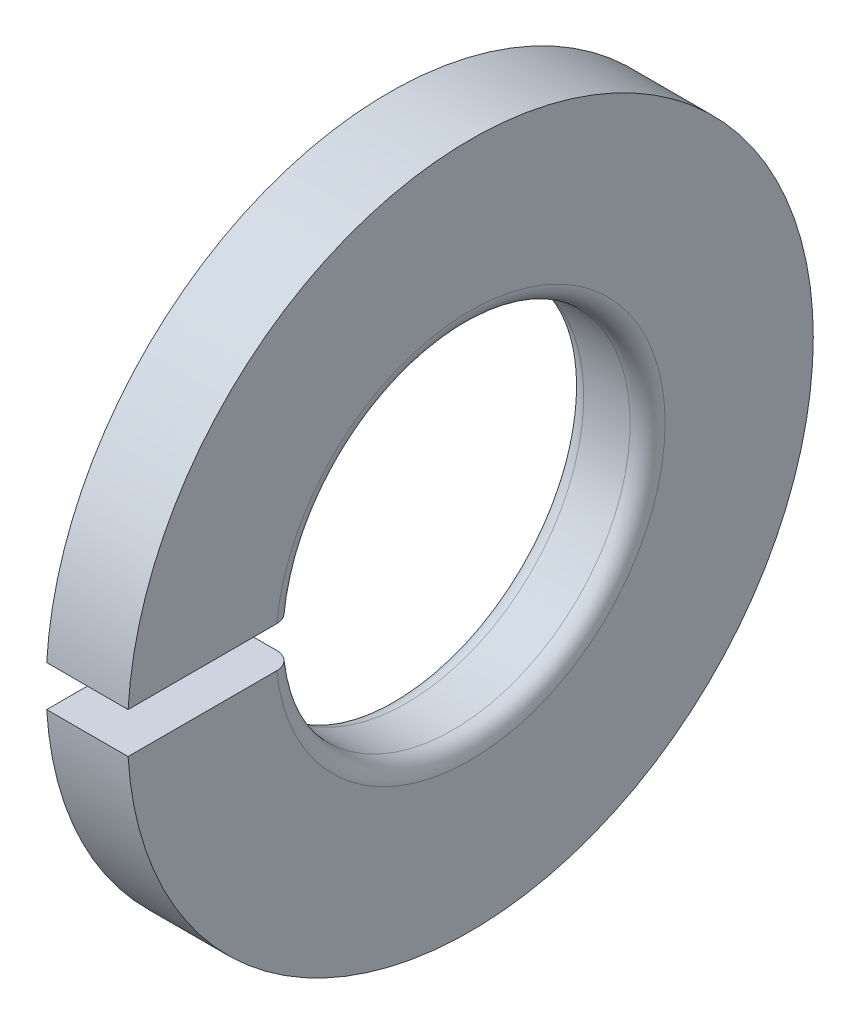
ISO-10303-21;
HEADER;
FILE_DESCRIPTION(('STEP AP214'),'2;1');
FILE_NAME('part.step','',(''),(''),'','','');
FILE_SCHEMA(('AUTOMOTIVE_DESIGN { 1 0 10303 214 1 1 1 1 }'));
ENDSEC;
DATA;
#1=APPLICATION_CONTEXT('core data for automotive mechanical design processes');
#2=APPLICATION_PROTOCOL_DEFINITION('international standard','automotive_design',2000,#1);
#3=PRODUCT_CONTEXT('',#1,'mechanical');
#4=PRODUCT('Part','Part','',(#3));
#5=PRODUCT_RELATED_PRODUCT_CATEGORY('part','',(#4));
#6=PRODUCT_DEFINITION_FORMATION('','',#4);
#7=PRODUCT_DEFINITION_CONTEXT('part definition',#1,'design');
#8=PRODUCT_DEFINITION('design','',#6,#7);
#9=PRODUCT_DEFINITION_SHAPE('','',#8);
#10=(LENGTH_UNIT() NAMED_UNIT(*) SI_UNIT(.MILLI.,.METRE.));
#11=(NAMED_UNIT(*) PLANE_ANGLE_UNIT() SI_UNIT($,.RADIAN.));
#12=(NAMED_UNIT(*) SI_UNIT($,.STERADIAN.) SOLID_ANGLE_UNIT());
#13=UNCERTAINTY_MEASURE_WITH_UNIT(LENGTH_MEASURE(1.E-05),#10,'distance_accuracy_value','');
#14=(GEOMETRIC_REPRESENTATION_CONTEXT(3) GLOBAL_UNCERTAINTY_ASSIGNED_CONTEXT((#13)) GLOBAL_UNIT_ASSIGNED_CONTEXT((#10,
#11,#12)) REPRESENTATION_CONTEXT('',''));
#15=CARTESIAN_POINT('',(0.,0.,0.));
#16=DIRECTION('',(0.,0.,1.));
#17=DIRECTION('',(1.,0.,0.));
#18=AXIS2_PLACEMENT_3D('',#15,#16,#17);
#19=CARTESIAN_POINT('',(-34.9250000000005,-4.44089209850063E-13,2.49800180540661E-13));
#20=DIRECTION('',(-1.,0.,0.));
#21=DIRECTION('',(0.,0.,1.));
#22=AXIS2_PLACEMENT_3D('',#19,#20,#21);
#23=CYLINDRICAL_SURFACE('',#22,5.9);
#24=DIRECTION('',(-1.,0.,0.));
#25=VECTOR('',#24,1.);
#26=CARTESIAN_POINT('',(-34.9250000000008,0.349999999999545,5.88960949469487));
#27=LINE('',#26,#25);
#28=CARTESIAN_POINT('',(0.,0.349999999999518,5.88960949469497));
#29=VERTEX_POINT('',#28);
#30=CARTESIAN_POINT('',(-1.40000000000062,0.349999999999448,5.8896094946949));
#31=VERTEX_POINT('',#30);
#32=EDGE_CURVE('E99',#29,#31,#27,.T.);
#33=ORIENTED_EDGE('',*,*,#32,.F.);
#34=CARTESIAN_POINT('',(0.,0.,0.));
#35=DIRECTION('',(-1.,0.,0.));
#36=DIRECTION('',(0.,0.,1.));
#37=AXIS2_PLACEMENT_3D('',#34,#35,#36);
#38=CIRCLE('',#37,5.9);
#39=CARTESIAN_POINT('',(-6.66133814775094E-13,-0.3500000000006,5.88960949469479));
#40=VERTEX_POINT('',#39);
#41=EDGE_CURVE('E11',#29,#40,#38,.T.);
#42=ORIENTED_EDGE('',*,*,#41,.T.);
#43=DIRECTION('',(1.,0.,0.));
#44=VECTOR('',#43,1.);
#45=CARTESIAN_POINT('',(-34.9250000000005,-0.350000000000697,5.88960949469491));
#46=LINE('',#45,#44);
#47=CARTESIAN_POINT('',(-1.40000000000046,-0.350000000000475,5.88960949469557));
#48=VERTEX_POINT('',#47);
#49=EDGE_CURVE('E106',#48,#40,#46,.T.);
#50=ORIENTED_EDGE('',*,*,#49,.F.);
#51=CARTESIAN_POINT('',(-1.40000000000073,-5.27355936696949E-13,-7.63278329429795E-13));
#52=DIRECTION('',(-1.,0.,0.));
#53=DIRECTION('',(0.,0.,1.));
#54=AXIS2_PLACEMENT_3D('',#51,#52,#53);
#55=CIRCLE('',#54,5.9);
#56=EDGE_CURVE('E107',#31,#48,#55,.T.);
#57=ORIENTED_EDGE('',*,*,#56,.F.);
#58=EDGE_LOOP('',(#33,#42,#50,#57));
#59=FACE_BOUND('',#58,.T.);
#60=ADVANCED_FACE('F17',(#59),#23,.T.);
#61=CARTESIAN_POINT('',(-7.7715611723761E-13,3.3499999999996,1.2490009027033E-13));
#62=DIRECTION('',(-1.,0.,0.));
#63=DIRECTION('',(0.,1.,0.));
#64=AXIS2_PLACEMENT_3D('',#61,#62,#63);
#65=PLANE('',#64);
#66=DIRECTION('',(0.,0.,-1.));
#67=VECTOR('',#66,1.);
#68=CARTESIAN_POINT('',(-7.21644966006352E-13,0.349999999999518,6.01800000000009));
#69=LINE('',#68,#67);
#70=CARTESIAN_POINT('',(-5.55111512312578E-13,0.349999999999351,3.33166624979156));
#71=VERTEX_POINT('',#70);
#72=EDGE_CURVE('E86',#29,#71,#69,.T.);
#73=ORIENTED_EDGE('',*,*,#72,.T.);
#74=CARTESIAN_POINT('',(0.,0.,0.));
#75=DIRECTION('',(-1.,0.,0.));
#76=DIRECTION('',(0.,0.,1.));
#77=AXIS2_PLACEMENT_3D('',#74,#75,#76);
#78=CIRCLE('',#77,3.35);
#79=CARTESIAN_POINT('',(-7.21644966006352E-13,-0.350000000000405,3.3316662497911));
#80=VERTEX_POINT('',#79);
#81=EDGE_CURVE('E30',#71,#80,#78,.T.);
#82=ORIENTED_EDGE('',*,*,#81,.T.);
#83=DIRECTION('',(0.,0.,1.));
#84=VECTOR('',#83,1.);
#85=CARTESIAN_POINT('',(-3.88578058618805E-13,-0.35000000000035,1.94289029309402E-13));
#86=LINE('',#85,#84);
#87=EDGE_CURVE('E93',#80,#40,#86,.T.);
#88=ORIENTED_EDGE('',*,*,#87,.T.);
#89=ORIENTED_EDGE('',*,*,#41,.F.);
#90=EDGE_LOOP('',(#73,#82,#88,#89));
#91=FACE_BOUND('',#90,.T.);
#92=ADVANCED_FACE('F87',(#91),#65,.F.);
#93=CARTESIAN_POINT('',(-0.300000000000411,-3.46944695195362E-13,0.));
#94=DIRECTION('',(-1.,0.,0.));
#95=DIRECTION('',(0.,0.,1.));
#96=AXIS2_PLACEMENT_3D('',#93,#94,#95);
#97=TOROIDAL_SURFACE('',#96,3.35,0.3);
#98=ORIENTED_EDGE('',*,*,#81,.F.);
#99=CARTESIAN_POINT('',(-4.11454724458249E-13,0.34999999999935,3.33166624979156));
#100=CARTESIAN_POINT('',(3.97194581053231E-08,0.35000000047887,3.32776441182345));
#101=CARTESIAN_POINT('',(-7.52897473257958E-05,0.349998285575235,3.32386258185037));
#102=CARTESIAN_POINT('',(-0.000372830599916117,0.349992078885482,3.31615772388963));
#103=CARTESIAN_POINT('',(-0.000591496449557879,0.349987654295,3.31235455866413));
#104=CARTESIAN_POINT('',(-0.00116487278012802,0.349976760957115,3.30485194569779));
#105=CARTESIAN_POINT('',(-0.00151612967323887,0.349970344781658,3.30115223368961));
#106=CARTESIAN_POINT('',(-0.00234390584776211,0.349956120349187,3.29386066548115));
#107=CARTESIAN_POINT('',(-0.00281706898756838,0.349948350964844,3.29026842793523));
#108=CARTESIAN_POINT('',(-0.00387804876884922,0.349931993678359,3.28319521659695));
#109=CARTESIAN_POINT('',(-0.00446260973747912,0.349923431913568,3.27971375414799));
#110=CARTESIAN_POINT('',(-0.00573596800415375,0.349905988436914,3.272864816612));
#111=CARTESIAN_POINT('',(-0.00642161295456528,0.349897121099407,3.26949675513673));
#112=CARTESIAN_POINT('',(-0.00788695419185057,0.349879493530749,3.26287670014251));
#113=CARTESIAN_POINT('',(-0.00866360352648926,0.349870736893964,3.25962403199745));
#114=CARTESIAN_POINT('',(-0.0103010211511929,0.34985368991656,3.25323626341923));
#115=CARTESIAN_POINT('',(-0.0111588496168063,0.349845393380562,3.25010040893869));
#116=CARTESIAN_POINT('',(-0.0129489964366211,0.349829561968438,3.24394717313006));
#117=CARTESIAN_POINT('',(-0.0138784825751384,0.349822012094758,3.24092896854012));
#118=CARTESIAN_POINT('',(-0.0158025474374004,0.349807908728883,3.23501159922061));
#119=CARTESIAN_POINT('',(-0.0167944041995281,0.349801332446623,3.23211154589493));
#120=CARTESIAN_POINT('',(-0.0198070590775789,0.349783647084879,3.22372102781086));
#121=CARTESIAN_POINT('',(-0.0219437586838095,0.349773850148086,3.21827163160146));
#122=CARTESIAN_POINT('',(-0.0263832604033917,0.34975996453874,3.20784813461972));
#123=CARTESIAN_POINT('',(-0.0286668866118989,0.349755552765651,3.20286583220635));
#124=CARTESIAN_POINT('',(-0.0333370246251934,0.349752585651872,3.19336589135284));
#125=CARTESIAN_POINT('',(-0.0357060508047633,0.349753653365766,3.1888396579461));
#126=CARTESIAN_POINT('',(-0.0404893172144344,0.349761201112909,3.18023761637484));
#127=CARTESIAN_POINT('',(-0.042887726779482,0.349767281704378,3.1761529968149));
#128=CARTESIAN_POINT('',(-0.0476778586639173,0.349783930872367,3.16841668881653));
#129=CARTESIAN_POINT('',(-0.0500553413668395,0.349794109893214,3.16475617726735));
#130=CARTESIAN_POINT('',(-0.0547572936718655,0.349817674362552,3.15784854646688));
#131=CARTESIAN_POINT('',(-0.0570690457649786,0.349830713070609,3.15459276365377));
#132=CARTESIAN_POINT('',(-0.0615985852245139,0.349858420717763,3.14847387641432));
#133=CARTESIAN_POINT('',(-0.0638051014666445,0.349872825086551,3.14560242198792));
#134=CARTESIAN_POINT('',(-0.0680883115633218,0.349901605807355,3.14023110637365));
#135=CARTESIAN_POINT('',(-0.0701551028015559,0.349915833448556,3.13772334341248));
#136=CARTESIAN_POINT('',(-0.0741278001367745,0.349942201691646,3.13305868414687));
#137=CARTESIAN_POINT('',(-0.0760250930199768,0.349954394962215,3.13089444700728));
#138=CARTESIAN_POINT('',(-0.0796321719781953,0.349975535935237,3.12689696822122));
#139=CARTESIAN_POINT('',(-0.0813345602227504,0.349984699412146,3.12505705328519));
#140=CARTESIAN_POINT('',(-0.0845294142516488,0.349995741609088,3.12169003523229));
#141=CARTESIAN_POINT('',(-0.0860156149554573,0.349998498447523,3.12015697255612));
#142=CARTESIAN_POINT('',(-0.0912683474581552,0.350003747911634,3.11485321836603));
#143=CARTESIAN_POINT('',(-0.0951200589966198,0.349999675211859,3.11116611214547));
#144=CARTESIAN_POINT('',(-0.102973198239483,0.349993205789086,3.10403863647258));
#145=CARTESIAN_POINT('',(-0.106972688877499,0.3499907923305,3.10059612698824));
#146=CARTESIAN_POINT('',(-0.115105334309075,0.349984146020349,3.09396093145274));
#147=CARTESIAN_POINT('',(-0.119236683192894,0.349979932206629,3.09076603341259));
#148=CARTESIAN_POINT('',(-0.12761653892363,0.349971581001876,3.08462819506886));
#149=CARTESIAN_POINT('',(-0.131863379197331,0.349967443271883,3.08168297879272));
#150=CARTESIAN_POINT('',(-0.140458207344465,0.349959525366788,3.07604559217182));
#151=CARTESIAN_POINT('',(-0.144804666504061,0.34995574189575,3.07335109111251));
#152=CARTESIAN_POINT('',(-0.153583036695909,0.349949052114152,3.068215265773));
#153=CARTESIAN_POINT('',(-0.158013557282895,0.349946136947473,3.06577156467494));
#154=CARTESIAN_POINT('',(-0.166944779872448,0.349941458572012,3.06113655550768));
#155=CARTESIAN_POINT('',(-0.171444228961535,0.349939683405925,3.05894283302129));
#156=CARTESIAN_POINT('',(-0.180498490508615,0.349937448833326,3.05480613921983));
#157=CARTESIAN_POINT('',(-0.185052186546371,0.349936975476656,3.05286072410706));
#158=CARTESIAN_POINT('',(-0.194200619151498,0.349937369039541,3.04921819908605));
#159=CARTESIAN_POINT('',(-0.198794374264785,0.349938221471951,3.04751862395013));
#160=CARTESIAN_POINT('',(-0.208009129854489,0.349941166855189,3.04436458403482));
#161=CARTESIAN_POINT('',(-0.212629281914602,0.349943246127256,3.04290764025649));
#162=CARTESIAN_POINT('',(-0.221883593116394,0.349948425314136,3.04023497471334));
#163=CARTESIAN_POINT('',(-0.22651703456362,0.349951513708137,3.03901676753168));
#164=CARTESIAN_POINT('',(-0.235785267349424,0.349958378272443,3.03681704750811));
#165=CARTESIAN_POINT('',(-0.240419469045867,0.349962146400575,3.0358330498797));
#166=CARTESIAN_POINT('',(-0.249677166512594,0.349969932312762,3.03409663952696));
#167=CARTESIAN_POINT('',(-0.254300197693666,0.349973946816595,3.03334174933736));
#168=CARTESIAN_POINT('',(-0.263524114606695,0.349981685991528,3.03205790508565));
#169=CARTESIAN_POINT('',(-0.268124657514582,0.349985413431765,3.03152648736757));
#170=CARTESIAN_POINT('',(-0.277292790000728,0.349991957131159,3.03068349416444));
#171=CARTESIAN_POINT('',(-0.281860154921754,0.349994783321304,3.03036947451517));
#172=CARTESIAN_POINT('',(-0.290951750851098,0.349998783844512,3.02995463774303));
#173=CARTESIAN_POINT('',(-0.295475871669206,0.349999976856305,3.02985140303332));
#174=CARTESIAN_POINT('',(-0.300000000000412,0.349999999999515,3.02985148150858));
#175=B_SPLINE_CURVE_WITH_KNOTS('',3,(#99,#100,#101,#102,#103,#104,#105,#106,#107,#108,#109,#110,
#111,#112,#113,#114,#115,#116,#117,#118,#119,#120,#121,#122,#123,#124,#125,#126,#127,#128,#129,
#130,#131,#132,#133,#134,#135,#136,#137,#138,#139,#140,#141,#142,#143,#144,#145,#146,#147,#148,
#149,#150,#151,#152,#153,#154,#155,#156,#157,#158,#159,#160,#161,#162,#163,#164,#165,#166,#167,
#168,#169,#170,#171,#172,#173,#174),.UNSPECIFIED.,.F.,.F.,(4,2,2,2,2,2,2,2,2,2,2,2,2,2,2,2,2,2,
2,2,2,2,2,2,2,2,2,2,2,2,2,2,2,2,2,2,2,4),(0.,0.0117047659951225,0.0231304080680162,
0.0342769596858536,0.0451444537144353,0.0557329223008812,0.0660423967742426,0.0760729075628829,
0.0858244841274597,0.0952971549083617,0.104490947286509,0.122040160517205,0.138474489763698,
0.153794072919013,0.167999033672319,0.181089482558123,0.19306551848913,0.203927230821878,
0.213674702125756,0.222308012058853,0.229827243247624,0.236232491231813,0.252220151702999,
0.268044092123626,0.283704689937802,0.299202318558838,0.31453734831854,0.329710147512186,
0.344721083530974,0.35957052407435,0.374258838435232,0.388786398851804,0.40315358192015,
0.417360770062612,0.431408353047363,0.445296729555235,0.459026308790393,0.472597512131959),.UNSPECIFIED.);
#176=CARTESIAN_POINT('',(-0.300000000000466,0.349999999999489,3.02985148150836));
#177=VERTEX_POINT('',#176);
#178=EDGE_CURVE('E103',#71,#177,#175,.T.);
#179=ORIENTED_EDGE('',*,*,#178,.T.);
#180=CARTESIAN_POINT('',(-0.300000000000411,-3.46944695195362E-13,0.));
#181=DIRECTION('',(-1.,0.,0.));
#182=DIRECTION('',(0.,0.,1.));
#183=AXIS2_PLACEMENT_3D('',#180,#181,#182);
#184=CIRCLE('',#183,3.05);
#185=CARTESIAN_POINT('',(-0.300000000000577,-0.350000000000613,3.02985148150767));
#186=VERTEX_POINT('',#185);
#187=EDGE_CURVE('E208',#177,#186,#184,.T.);
#188=ORIENTED_EDGE('',*,*,#187,.T.);
#189=CARTESIAN_POINT('',(-0.300000000000412,-0.35000000000072,3.02985148150852));
#190=CARTESIAN_POINT('',(-0.295475778524137,-0.349999976713344,3.02985140303064));
#191=CARTESIAN_POINT('',(-0.290951564578226,-0.349998768984415,3.02995464369786));
#192=CARTESIAN_POINT('',(-0.28185940427964,-0.349994716090859,3.03036952079231));
#193=CARTESIAN_POINT('',(-0.277291568920318,-0.349991851847326,3.03068359235581));
#194=CARTESIAN_POINT('',(-0.268122123199459,-0.3499852150844,3.03152676954638));
#195=CARTESIAN_POINT('',(-0.263520739156898,-0.349981432374192,3.03205833723541));
#196=CARTESIAN_POINT('',(-0.254294778359183,-0.349973571473287,3.03334261386123));
#197=CARTESIAN_POINT('',(-0.249670546998602,-0.349969490375831,3.03409780464448));
#198=CARTESIAN_POINT('',(-0.240410103548976,-0.349961565861136,3.03583500099532));
#199=CARTESIAN_POINT('',(-0.235774359578607,-0.349957725697025,3.0368195024636));
#200=CARTESIAN_POINT('',(-0.226502718033254,-0.349950717272841,3.03902046699721));
#201=CARTESIAN_POINT('',(-0.221867414636645,-0.349947557124426,3.0402394334731));
#202=CARTESIAN_POINT('',(-0.212609082311814,-0.349942240074517,3.04291390560751));
#203=CARTESIAN_POINT('',(-0.207986776666572,-0.349940094846041,3.04437191543514));
#204=CARTESIAN_POINT('',(-0.198767449356014,-0.349937028357908,3.04752842525291));
#205=CARTESIAN_POINT('',(-0.194171282790402,-0.3499361209976,3.04922942305672));
#206=CARTESIAN_POINT('',(-0.185017801159824,-0.349935633197956,3.05287517909438));
#207=CARTESIAN_POINT('',(-0.180461475366433,-0.349936067519982,3.05482242136236));
#208=CARTESIAN_POINT('',(-0.171401772392869,-0.34993824404558,3.05896320052741));
#209=CARTESIAN_POINT('',(-0.166899520619788,-0.349940000512469,3.06115919994449));
#210=CARTESIAN_POINT('',(-0.157962560705345,-0.349944665350465,3.06579923628983));
#211=CARTESIAN_POINT('',(-0.153529115664688,-0.349947586014546,3.06824570619267));
#212=CARTESIAN_POINT('',(-0.144744820205648,-0.349954314151806,3.07338758098609));
#213=CARTESIAN_POINT('',(-0.140395371645574,-0.349958130828193,3.0760853810015));
#214=CARTESIAN_POINT('',(-0.131794549532968,-0.34996614442557,3.08172991153473));
#215=CARTESIAN_POINT('',(-0.12754471735527,-0.349970344968829,3.08467899073336));
#216=CARTESIAN_POINT('',(-0.119158928826027,-0.349978855809157,3.09082513003152));
#217=CARTESIAN_POINT('',(-0.115024652964391,-0.349983166797225,3.09402448363486));
#218=CARTESIAN_POINT('',(-0.106886277032403,-0.349990031840011,3.10066918888495));
#219=CARTESIAN_POINT('',(-0.102883998076605,-0.349992566984715,3.10411676951706));
#220=CARTESIAN_POINT('',(-0.0950254779794755,-0.349999345547218,3.11125500298543));
#221=CARTESIAN_POINT('',(-0.0911711903047576,-0.350003606469756,3.11494781221734));
#222=CARTESIAN_POINT('',(-0.0859209692445729,-0.34999856063323,3.12025398823588));
#223=CARTESIAN_POINT('',(-0.0844395048980924,-0.349995868097675,3.12178350591464));
#224=CARTESIAN_POINT('',(-0.0812538018365271,-0.349984944982149,3.12514363527596));
#225=CARTESIAN_POINT('',(-0.0795558222571992,-0.349975829653423,3.12698019602622));
#226=CARTESIAN_POINT('',(-0.0759572133946984,-0.349954779386857,3.13097114340818));
#227=CARTESIAN_POINT('',(-0.0740639776224488,-0.349942626734853,3.13313219463646));
#228=CARTESIAN_POINT('',(-0.0700990266390184,-0.349916328248801,3.13779064299611));
#229=CARTESIAN_POINT('',(-0.0680359221735455,-0.349902128003736,3.1402953743148));
#230=CARTESIAN_POINT('',(-0.0637597011224595,-0.349873390652761,3.14566077918092));
#231=CARTESIAN_POINT('',(-0.061556486541722,-0.349859001421441,3.14852934981057));
#232=CARTESIAN_POINT('',(-0.0570331540790325,-0.349831312080679,3.15464262144826));
#233=CARTESIAN_POINT('',(-0.0547243086632288,-0.349818276079231,3.15789566967272));
#234=CARTESIAN_POINT('',(-0.0500277668191557,-0.349794705974681,3.16479799015008));
#235=CARTESIAN_POINT('',(-0.0476527912954953,-0.349784518487617,3.16845592497336));
#236=CARTESIAN_POINT('',(-0.042867270332249,-0.349767842819622,3.17618725217824));
#237=CARTESIAN_POINT('',(-0.0404709700859374,-0.349761744296504,3.18026946831989));
#238=CARTESIAN_POINT('',(-0.0356915252037683,-0.349754153269067,3.18886689562997));
#239=CARTESIAN_POINT('',(-0.0333242191332589,-0.349753060478359,3.19339092028564));
#240=CARTESIAN_POINT('',(-0.0286571382659346,-0.349755972604134,3.20288666143804));
#241=CARTESIAN_POINT('',(-0.0263748594721038,-0.349760354850847,3.20786697618395));
#242=CARTESIAN_POINT('',(-0.0219376924475326,-0.34977417942547,3.21828674408136));
#243=CARTESIAN_POINT('',(-0.0198019931277447,-0.34978394530094,3.22373440306339));
#244=CARTESIAN_POINT('',(-0.0167906360281222,-0.349801585114392,3.23212238615293));
#245=CARTESIAN_POINT('',(-0.0157991592565872,-0.349808146302371,3.23502167608794));
#246=CARTESIAN_POINT('',(-0.0138757794786927,-0.349822220117447,3.24093759249503));
#247=CARTESIAN_POINT('',(-0.0129466005871972,-0.349829755589896,3.24395510816725));
#248=CARTESIAN_POINT('',(-0.0111569991491917,-0.349845559167232,3.25010704400972));
#249=CARTESIAN_POINT('',(-0.0102994111554667,-0.349853842321487,3.25324228804465));
#250=CARTESIAN_POINT('',(-0.0086624118950354,-0.349870863802545,3.25962891732616));
#251=CARTESIAN_POINT('',(-0.00788594297608483,-0.349879608371247,3.2628810572092));
#252=CARTESIAN_POINT('',(-0.00642090719148728,-0.349897213332518,3.26950014081095));
#253=CARTESIAN_POINT('',(-0.00573538999005258,-0.34990607017015,3.27286775971472));
#254=CARTESIAN_POINT('',(-0.00446223973682665,-0.349923494390143,3.27971590045932));
#255=CARTESIAN_POINT('',(-0.00387776193474389,-0.349932047428625,3.28319700920074));
#256=CARTESIAN_POINT('',(-0.00281690957818603,-0.349948389163389,3.29026960430015));
#257=CARTESIAN_POINT('',(-0.00234379378932176,-0.34995615174194,3.29386157976296));
#258=CARTESIAN_POINT('',(-0.00151608265570326,-0.349970364555599,3.30115271731383));
#259=CARTESIAN_POINT('',(-0.00116484673540011,-0.349976775924865,3.30485226111324));
#260=CARTESIAN_POINT('',(-0.000591492584252551,-0.34998766165937,3.31235463291441));
#261=CARTESIAN_POINT('',(-0.000372831412825332,-0.349992083444725,3.31615772544759));
#262=CARTESIAN_POINT('',(-7.52906648593157E-05,-0.34999828646546,3.32386253433));
#263=CARTESIAN_POINT('',(3.97196462329437E-08,-0.35000000048055,3.32776438805962));
#264=CARTESIAN_POINT('',(-4.11292094132376E-13,-0.350000000000402,3.3316662497911));
#265=B_SPLINE_CURVE_WITH_KNOTS('',3,(#189,#190,#191,#192,#193,#194,#195,#196,#197,#198,#199,
#200,#201,#202,#203,#204,#205,#206,#207,#208,#209,#210,#211,#212,#213,#214,#215,#216,#217,#218,
#219,#220,#221,#222,#223,#224,#225,#226,#227,#228,#229,#230,#231,#232,#233,#234,#235,#236,#237,
#238,#239,#240,#241,#242,#243,#244,#245,#246,#247,#248,#249,#250,#251,#252,#253,#254,#255,#256,
#257,#258,#259,#260,#261,#262,#263,#264),.UNSPECIFIED.,.F.,.F.,(4,2,2,2,2,2,2,2,2,2,2,2,2,2,2,2,
2,2,2,2,2,2,2,2,2,2,2,2,2,2,2,2,2,2,2,2,2,4),(0.,0.0135714826872679,0.0273024790394514,
0.0411934112032596,0.0552446890296675,0.0694567117377665,0.0838298695369216,0.0983645452043909,
0.113061115615037,0.12791995321921,0.142941427464293,0.15812590615482,0.173473756745436,
0.188985347560365,0.20466104893237,0.220501234253615,0.236506280930143,0.242894006860302,
0.250396874942171,0.259014980695849,0.268748406655177,0.27959723236157,0.291561540262089,
0.304641419592922,0.318836969152166,0.334148299367901,0.350575533833149,0.368118810357126,
0.377310067757569,0.386780493106854,0.396530113790853,0.406558958256579,0.416867055973012,
0.427454437378562,0.438321133814054,0.449467177440098,0.460892601137664,0.472597438390713),.UNSPECIFIED.);
#266=EDGE_CURVE('E225',#186,#80,#265,.T.);
#267=ORIENTED_EDGE('',*,*,#266,.T.);
#268=EDGE_LOOP('',(#98,#179,#188,#267));
#269=FACE_BOUND('',#268,.T.);
#270=ADVANCED_FACE('F234',(#269),#97,.T.);
#271=CARTESIAN_POINT('',(-34.9250000000005,-4.44089209850063E-13,2.49800180540661E-13));
#272=DIRECTION('',(-1.,0.,0.));
#273=DIRECTION('',(0.,0.,1.));
#274=AXIS2_PLACEMENT_3D('',#271,#272,#273);
#275=CYLINDRICAL_SURFACE('',#274,3.05);
#276=DIRECTION('',(1.,0.,0.));
#277=VECTOR('',#276,1.);
#278=CARTESIAN_POINT('',(-34.925000000001,0.349999999999573,3.02985148150859));
#279=LINE('',#278,#277);
#280=CARTESIAN_POINT('',(-1.10000000000066,0.349999999999532,3.02985148150574));
#281=VERTEX_POINT('',#280);
#282=EDGE_CURVE('E186',#281,#177,#279,.T.);
#283=ORIENTED_EDGE('',*,*,#282,.F.);
#284=CARTESIAN_POINT('',(-1.1000000000001,-1.2490009027033E-13,0.));
#285=DIRECTION('',(-1.,0.,0.));
#286=DIRECTION('',(0.,0.,1.));
#287=AXIS2_PLACEMENT_3D('',#284,#285,#286);
#288=CIRCLE('',#287,3.05);
#289=CARTESIAN_POINT('',(-1.1000000000006,-0.350000000000517,3.02985148150831));
#290=VERTEX_POINT('',#289);
#291=EDGE_CURVE('E196',#281,#290,#288,.T.);
#292=ORIENTED_EDGE('',*,*,#291,.T.);
#293=DIRECTION('',(-1.,0.,0.));
#294=VECTOR('',#293,1.);
#295=CARTESIAN_POINT('',(-34.9250000000005,-0.350000000000322,3.029851481508));
#296=LINE('',#295,#294);
#297=EDGE_CURVE('E219',#186,#290,#296,.T.);
#298=ORIENTED_EDGE('',*,*,#297,.F.);
#299=ORIENTED_EDGE('',*,*,#187,.F.);
#300=EDGE_LOOP('',(#283,#292,#298,#299));
#301=FACE_BOUND('',#300,.T.);
#302=ADVANCED_FACE('F145',(#301),#275,.F.);
#303=CARTESIAN_POINT('',(-1.1000000000001,-1.2490009027033E-13,0.));
#304=DIRECTION('',(-1.,0.,0.));
#305=DIRECTION('',(0.,0.,1.));
#306=AXIS2_PLACEMENT_3D('',#303,#304,#305);
#307=TOROIDAL_SURFACE('',#306,3.35,0.3);
#308=ORIENTED_EDGE('',*,*,#291,.F.);
#309=CARTESIAN_POINT('',(-1.1000000000001,0.349999999999862,3.0298514815086));
#310=CARTESIAN_POINT('',(-1.10452588994416,0.349999976664719,3.0298514029152));
#311=CARTESIAN_POINT('',(-1.10905177234283,0.349998766653874,3.02995471996245));
#312=CARTESIAN_POINT('',(-1.11814733416078,0.349994706069957,3.03036990610726));
#313=CARTESIAN_POINT('',(-1.1227169023471,0.34999183636177,3.03068421469613));
#314=CARTESIAN_POINT('',(-1.13188986657425,0.349985186877176,3.03152803425855));
#315=CARTESIAN_POINT('',(-1.1364930358037,0.349981396879691,3.03206001171925));
#316=CARTESIAN_POINT('',(-1.14572260668388,0.349973520751382,3.03334528747954));
#317=CARTESIAN_POINT('',(-1.15034866218336,0.349969431704782,3.03410107210231));
#318=CARTESIAN_POINT('',(-1.15961277906496,0.34996149165472,3.03583964631657));
#319=CARTESIAN_POINT('',(-1.16425037129625,0.349957643913398,3.03682493632157));
#320=CARTESIAN_POINT('',(-1.17352571856643,0.349950621545185,3.03902767782798));
#321=CARTESIAN_POINT('',(-1.17816287810905,0.349947455053225,3.04024763727101));
#322=CARTESIAN_POINT('',(-1.18742491459873,0.349942127192979,3.04292430394611));
#323=CARTESIAN_POINT('',(-1.1920490666498,0.34993997753149,3.04438351987788));
#324=CARTESIAN_POINT('',(-1.2012720599689,0.34993690451809,3.04754265805428));
#325=CARTESIAN_POINT('',(-1.20587004422082,0.349935995105935,3.04924508262271));
#326=CARTESIAN_POINT('',(-1.21502711444566,0.349935505786158,3.05289391456776));
#327=CARTESIAN_POINT('',(-1.21958520892009,0.349935940682975,3.05484281044704));
#328=CARTESIAN_POINT('',(-1.228648381265,0.349938120946396,3.05898712396808));
#329=CARTESIAN_POINT('',(-1.23315233118514,0.349939880618085,3.06118500853451));
#330=CARTESIAN_POINT('',(-1.24209259702928,0.349944554197,3.06582904543497));
#331=CARTESIAN_POINT('',(-1.24652764698862,0.349947480433478,3.06827763506098));
#332=CARTESIAN_POINT('',(-1.25531503848581,0.349954221535779,3.07342398089712));
#333=CARTESIAN_POINT('',(-1.25966597497795,0.349958045631983,3.0761241364379));
#334=CARTESIAN_POINT('',(-1.26826963474717,0.349966075017413,3.08177360899199));
#335=CARTESIAN_POINT('',(-1.27252081313712,0.349970283941112,3.08472527875477));
#336=CARTESIAN_POINT('',(-1.28090913072155,0.349978811600266,3.09087682750648));
#337=CARTESIAN_POINT('',(-1.28504458559088,0.349983131026594,3.09407900390549));
#338=CARTESIAN_POINT('',(-1.29318513005295,0.349990010710533,3.1007295778757));
#339=CARTESIAN_POINT('',(-1.29718839437096,0.349992552016352,3.10418020814567));
#340=CARTESIAN_POINT('',(-1.30504867013576,0.349999342264333,3.11132475758618));
#341=CARTESIAN_POINT('',(-1.30890372365314,0.3500036087192,3.11502083665847));
#342=CARTESIAN_POINT('',(-1.31415263003653,0.349998561837154,3.1203294702566));
#343=CARTESIAN_POINT('',(-1.31563218117158,0.349995872925868,3.12185807273623));
#344=CARTESIAN_POINT('',(-1.31881399550873,0.349984963478287,3.12521636415272));
#345=CARTESIAN_POINT('',(-1.32051000358807,0.349975858525447,3.12705199435442));
#346=CARTESIAN_POINT('',(-1.32410462189357,0.349954832198298,3.13104105247099));
#347=CARTESIAN_POINT('',(-1.32599584281378,0.349942693342765,3.13320113695217));
#348=CARTESIAN_POINT('',(-1.32995673288714,0.349916424050159,3.13785760300817));
#349=CARTESIAN_POINT('',(-1.33201779577187,0.349902239271466,3.14036131056856));
#350=CARTESIAN_POINT('',(-1.33628992071195,0.34987353258781,3.14572459908479));
#351=CARTESIAN_POINT('',(-1.33849108559531,0.349859158509132,3.14859206881944));
#352=CARTESIAN_POINT('',(-1.34301032620168,0.349831497602919,3.15470305082873));
#353=CARTESIAN_POINT('',(-1.34531713472744,0.349818474737642,3.15795490199434));
#354=CARTESIAN_POINT('',(-1.35000963331124,0.349794927637701,3.16485472307418));
#355=CARTESIAN_POINT('',(-1.35238260824531,0.349784749807359,3.16851134730225));
#356=CARTESIAN_POINT('',(-1.3571641842293,0.34976808909843,3.17623993276661));
#357=CARTESIAN_POINT('',(-1.35955854644683,0.349761995627026,3.18032070967919));
#358=CARTESIAN_POINT('',(-1.36433419994267,0.349754409645336,3.18891512550462));
#359=CARTESIAN_POINT('',(-1.36669965965381,0.349753316585888,3.19343757010741));
#360=CARTESIAN_POINT('',(-1.3713631638233,0.349756222881597,3.20293000938359));
#361=CARTESIAN_POINT('',(-1.37364371996287,0.349760599317441,3.20790859493263));
#362=CARTESIAN_POINT('',(-1.37807759146193,0.349774407289221,3.21832475764696));
#363=CARTESIAN_POINT('',(-1.38021172629411,0.349784162160541,3.22377053380174));
#364=CARTESIAN_POINT('',(-1.38322089675538,0.349801782670669,3.23215559042109));
#365=CARTESIAN_POINT('',(-1.38421166297171,0.349808336819688,3.23505388344784));
#366=CARTESIAN_POINT('',(-1.38613367403925,0.34982239572367,3.24096776947817));
#367=CARTESIAN_POINT('',(-1.38706219595778,0.349829923310088,3.2439842509682));
#368=CARTESIAN_POINT('',(-1.38885054080714,0.349845710517099,3.25013408313177));
#369=CARTESIAN_POINT('',(-1.38970753041288,0.34985398517869,3.25326825701659));
#370=CARTESIAN_POINT('',(-1.39134339518771,0.349870989361312,3.25965271219968));
#371=CARTESIAN_POINT('',(-1.39211932927843,0.349879725122089,3.26290374754283));
#372=CARTESIAN_POINT('',(-1.3935833627086,0.349897312490505,3.26952059029817));
#373=CARTESIAN_POINT('',(-1.39426841369379,0.349906160547908,3.27288707237213));
#374=CARTESIAN_POINT('',(-1.3955407038396,0.349923567619404,3.27973291020323));
#375=CARTESIAN_POINT('',(-1.39612478909853,0.349932112301793,3.28321285241116));
#376=CARTESIAN_POINT('',(-1.39718493370519,0.349948438179354,3.29028308822521));
#377=CARTESIAN_POINT('',(-1.39765773567064,0.349956193277033,3.29387387056541));
#378=CARTESIAN_POINT('',(-1.39848490144562,0.349970392482001,3.3011625992299));
#379=CARTESIAN_POINT('',(-1.39883590724584,0.349976797752303,3.30486092697937));
#380=CARTESIAN_POINT('',(-1.39940888831915,0.349987673195646,3.31236084818011));
#381=CARTESIAN_POINT('',(-1.39962740797617,0.349992090826795,3.31616270596666));
#382=CARTESIAN_POINT('',(-1.39992475751448,0.349998288055135,3.32386503158138));
#383=CARTESIAN_POINT('',(-1.40000003966923,0.350000000479642,3.32776563668925));
#384=CARTESIAN_POINT('',(-1.4000000000001,0.349999999999642,3.33166624979146));
#385=B_SPLINE_CURVE_WITH_KNOTS('',3,(#309,#310,#311,#312,#313,#314,#315,#316,#317,#318,#319,
#320,#321,#322,#323,#324,#325,#326,#327,#328,#329,#330,#331,#332,#333,#334,#335,#336,#337,#338,
#339,#340,#341,#342,#343,#344,#345,#346,#347,#348,#349,#350,#351,#352,#353,#354,#355,#356,#357,
#358,#359,#360,#361,#362,#363,#364,#365,#366,#367,#368,#369,#370,#371,#372,#373,#374,#375,#376,
#377,#378,#379,#380,#381,#382,#383,#384),.UNSPECIFIED.,.F.,.F.,(4,2,2,2,2,2,2,2,2,2,2,2,2,2,2,2,
2,2,2,2,2,2,2,2,2,2,2,2,2,2,2,2,2,2,2,2,2,4),(0.,0.0135764867752446,0.0273127125823064,
0.0412091000958716,0.0552660596665783,0.0694839909890411,0.0838632847280186,0.098404324099872,
0.113107486405944,0.127973144513924,0.143001668282681,0.158193425925467,0.173548785305731,
0.1890681151592,0.204751786235197,0.220600172349551,0.236613651340826,0.24299541352961,
0.250492218927288,0.259104162868874,0.268831327744517,0.279673792977145,0.291631640909413,
0.304704960679467,0.318893850988271,0.334198422163769,0.350618797693103,0.368155115272075,
0.377342854443438,0.386809736431232,0.39655578860146,0.406581039380739,0.416885518217177,
0.427469255527904,0.438332282632145,0.449474631668688,0.460896335496588,0.472597427577939),.UNSPECIFIED.);
#386=CARTESIAN_POINT('',(-1.40000000000079,0.349999999999642,3.33166624979147));
#387=VERTEX_POINT('',#386);
#388=EDGE_CURVE('E117',#281,#387,#385,.T.);
#389=ORIENTED_EDGE('',*,*,#388,.T.);
#390=CARTESIAN_POINT('',(-1.40000000000073,-5.27355936696949E-13,-7.63278329429795E-13));
#391=DIRECTION('',(-1.,0.,0.));
#392=DIRECTION('',(0.,0.,1.));
#393=AXIS2_PLACEMENT_3D('',#390,#391,#392);
#394=CIRCLE('',#393,3.35);
#395=CARTESIAN_POINT('',(-1.40000000000035,-0.350000000000627,3.33166624979095));
#396=VERTEX_POINT('',#395);
#397=EDGE_CURVE('E37',#387,#396,#394,.T.);
#398=ORIENTED_EDGE('',*,*,#397,.T.);
#399=CARTESIAN_POINT('',(-1.4000000000001,-0.350000000000634,3.33166624979095));
#400=CARTESIAN_POINT('',(-1.40000003975691,-0.35000000048023,3.32776350674428));
#401=CARTESIAN_POINT('',(-1.39992467532096,-0.349998284425922,3.32386077169813));
#402=CARTESIAN_POINT('',(-1.39962699584598,-0.349992073547319,3.31615411413235));
#403=CARTESIAN_POINT('',(-1.39940822742007,-0.349987645953289,3.31235005430135));
#404=CARTESIAN_POINT('',(-1.39883458070432,-0.349976745177007,3.30484566622784));
#405=CARTESIAN_POINT('',(-1.39848315706241,-0.349970324594294,3.30114507357481));
#406=CARTESIAN_POINT('',(-1.39765498577306,-0.349956090330906,3.29385176130806));
#407=CARTESIAN_POINT('',(-1.39718159530609,-0.349948315543813,3.29025866013985));
#408=CARTESIAN_POINT('',(-1.3961201029276,-0.34993194680894,3.28318374149728));
#409=CARTESIAN_POINT('',(-1.39553525770394,-0.349923379013122,3.27970143509582));
#410=CARTESIAN_POINT('',(-1.39426127670429,-0.34990592316405,3.27285083190122));
#411=CARTESIAN_POINT('',(-1.39357529426457,-0.349897049493876,3.26948194839178));
#412=CARTESIAN_POINT('',(-1.39210922755551,-0.34987940924177,3.26286027349298));
#413=CARTESIAN_POINT('',(-1.39133219119866,-0.349870646257474,3.259606807096));
#414=CARTESIAN_POINT('',(-1.38969395275879,-0.349853586819778,3.25321746773738));
#415=CARTESIAN_POINT('',(-1.38883569143028,-0.349845284169271,3.25008084029724));
#416=CARTESIAN_POINT('',(-1.38704463577831,-0.349829440977654,3.24392608546871));
#417=CARTESIAN_POINT('',(-1.38611467456959,-0.349821885432735,3.24090713434252));
#418=CARTESIAN_POINT('',(-1.38418962014512,-0.349807771351185,3.23498829982621));
#419=CARTESIAN_POINT('',(-1.38319724975628,-0.349801190014207,3.23208752732032));
#420=CARTESIAN_POINT('',(-1.38018301476966,-0.349783490804206,3.22369489934729));
#421=CARTESIAN_POINT('',(-1.37804518491953,-0.349773685989509,3.21824414619581));
#422=CARTESIAN_POINT('',(-1.37360330330037,-0.349759788540073,3.20781805284889));
#423=CARTESIAN_POINT('',(-1.37131843356244,-0.349755372649261,3.2028345060376));
#424=CARTESIAN_POINT('',(-1.36664571468212,-0.349752401485728,3.19333219093407));
#425=CARTESIAN_POINT('',(-1.36427535677302,-0.349753469085146,3.18880482231812));
#426=CARTESIAN_POINT('',(-1.35948935689404,-0.34976102062854,3.18020061905366));
#427=CARTESIAN_POINT('',(-1.35708955068934,-0.349767104939059,3.17611496735023));
#428=CARTESIAN_POINT('',(-1.35229657712246,-0.349783765034685,3.1683766950832));
#429=CARTESIAN_POINT('',(-1.34991765400479,-0.349793951081799,3.1647152455475));
#430=CARTESIAN_POINT('',(-1.34521279193758,-0.349817532242987,3.15780582791748));
#431=CARTESIAN_POINT('',(-1.34289957469486,-0.349830580463251,3.1545491902813));
#432=CARTESIAN_POINT('',(-1.33836709339053,-0.349858308660889,3.14842866996573));
#433=CARTESIAN_POINT('',(-1.33615910427093,-0.349872723963553,3.14555643126341));
#434=CARTESIAN_POINT('',(-1.33187295231869,-0.349901526773797,3.1401836098564));
#435=CARTESIAN_POINT('',(-1.32980469559519,-0.349915765537986,3.13767511937907));
#436=CARTESIAN_POINT('',(-1.32582908487598,-0.349942154719389,3.13300905320537));
#437=CARTESIAN_POINT('',(-1.3239303473206,-0.349954357861447,3.13084413075591));
#438=CARTESIAN_POINT('',(-1.32032040876974,-0.349975515904016,3.12684531432025));
#439=CARTESIAN_POINT('',(-1.31861660862529,-0.349984686753935,3.12500474125886));
#440=CARTESIAN_POINT('',(-1.31541897140651,-0.34999573849038,3.12163642473661));
#441=CARTESIAN_POINT('',(-1.3139314022865,-0.34999849776194,3.12010271610272));
#442=CARTESIAN_POINT('',(-1.30867772902761,-0.350003745724217,3.11480073342151));
#443=CARTESIAN_POINT('',(-1.30482656470974,-0.349999676235835,3.11111597101211));
#444=CARTESIAN_POINT('',(-1.2969746807251,-0.349993213972547,3.10399302365588));
#445=CARTESIAN_POINT('',(-1.29297589497548,-0.349990804464255,3.10055270114529));
#446=CARTESIAN_POINT('',(-1.28484480154454,-0.349984167826147,3.09392171525662));
#447=CARTESIAN_POINT('',(-1.28071429683682,-0.349979959703431,3.09072884250433));
#448=CARTESIAN_POINT('',(-1.27233625266429,-0.34997161998289,3.08459488632388));
#449=CARTESIAN_POINT('',(-1.26809037706533,-0.349967488044355,3.08165152967446));
#450=CARTESIAN_POINT('',(-1.25949758311994,-0.349959581143361,3.07601769164137));
#451=CARTESIAN_POINT('',(-1.25515219100745,-0.349955802892211,3.07332488240951));
#452=CARTESIAN_POINT('',(-1.24637604192716,-0.349949122313251,3.06819226927591));
#453=CARTESIAN_POINT('',(-1.24194667315363,-0.349946211147263,3.06575009151998));
#454=CARTESIAN_POINT('',(-1.23301782405311,-0.349941539139308,3.06111795824038));
#455=CARTESIAN_POINT('',(-1.22851959461658,-0.349939766364593,3.05892559134252));
#456=CARTESIAN_POINT('',(-1.21946782582592,-0.349937534731283,3.05479143987892));
#457=CARTESIAN_POINT('',(-1.21491540109514,-0.349937061951151,3.05284721462067));
#458=CARTESIAN_POINT('',(-1.2057695489631,-0.349937454806406,3.04920690362486));
#459=CARTESIAN_POINT('',(-1.20117710144216,-0.349938305984399,3.04750835581051));
#460=CARTESIAN_POINT('',(-1.19196498417944,-0.349941247156685,3.04435620909394));
#461=CARTESIAN_POINT('',(-1.18734616149932,-0.349943323500299,3.0429001343737));
#462=CARTESIAN_POINT('',(-1.17809451840519,-0.349948495450634,3.04022905071422));
#463=CARTESIAN_POINT('',(-1.17346241454518,-0.349951579560171,3.03901155955418));
#464=CARTESIAN_POINT('',(-1.16419685344481,-0.349958434648927,3.03681312141633));
#465=CARTESIAN_POINT('',(-1.15956398491455,-0.349962197602422,3.03582969284904));
#466=CARTESIAN_POINT('',(-1.15030893843864,-0.349969972867149,3.03409427728784));
#467=CARTESIAN_POINT('',(-1.14568722435205,-0.34997398190479,3.03333981601342));
#468=CARTESIAN_POINT('',(-1.13646591543291,-0.349981710584013,3.0320566937475));
#469=CARTESIAN_POINT('',(-1.13186666288902,-0.349985432988891,3.03152557225996));
#470=CARTESIAN_POINT('',(-1.12270107509393,-0.349991967883261,3.03068304367199));
#471=CARTESIAN_POINT('',(-1.11813496415147,-0.349994790283166,3.03036919553151));
#472=CARTESIAN_POINT('',(-1.10904583129309,-0.349998785467056,3.02995458250978));
#473=CARTESIAN_POINT('',(-1.10452291939775,-0.349999976891164,3.02985140311692));
#474=CARTESIAN_POINT('',(-1.1000000000001,-0.350000000000557,3.02985148150855));
#475=B_SPLINE_CURVE_WITH_KNOTS('',3,(#399,#400,#401,#402,#403,#404,#405,#406,#407,#408,#409,
#410,#411,#412,#413,#414,#415,#416,#417,#418,#419,#420,#421,#422,#423,#424,#425,#426,#427,#428,
#429,#430,#431,#432,#433,#434,#435,#436,#437,#438,#439,#440,#441,#442,#443,#444,#445,#446,#447,
#448,#449,#450,#451,#452,#453,#454,#455,#456,#457,#458,#459,#460,#461,#462,#463,#464,#465,#466,
#467,#468,#469,#470,#471,#472,#473,#474),.UNSPECIFIED.,.F.,.F.,(4,2,2,2,2,2,2,2,2,2,2,2,2,2,2,2,
2,2,2,2,2,2,2,2,2,2,2,2,2,2,2,2,2,2,2,2,2,4),(0.,0.0117074807113584,0.0231358179340613,
0.0342850451512212,0.045155195244605,0.0557463003772254,0.0660583918938593,0.0760915002383572,
0.0858456548865588,0.0953208842936838,0.104517215855094,0.12207144759578,0.138510717958419,
0.153835164918074,0.168044912240448,0.181140070532367,0.193120738776657,0.2039870064006,
0.213738956048937,0.222376667465319,0.229900223380093,0.236309719467125,0.252291342280152,
0.26810940797914,0.283764293694929,0.299256372534014,0.314586014526599,0.329753587670105,
0.34475945905996,0.35960399610006,0.374287567785975,0.38881054605455,0.403173307194206,
0.41737623331083,0.431419713844748,0.445304147134837,0.459029942026351,0.472597519519603),.UNSPECIFIED.);
#476=EDGE_CURVE('E130',#396,#290,#475,.T.);
#477=ORIENTED_EDGE('',*,*,#476,.T.);
#478=EDGE_LOOP('',(#308,#389,#398,#477));
#479=FACE_BOUND('',#478,.T.);
#480=ADVANCED_FACE('F132',(#479),#307,.T.);
#481=CARTESIAN_POINT('',(-1.40000000000046,5.89999999999938,-1.11022302462516E-13));
#482=DIRECTION('',(1.,0.,0.));
#483=DIRECTION('',(0.,-1.,0.));
#484=AXIS2_PLACEMENT_3D('',#481,#482,#483);
#485=PLANE('',#484);
#486=DIRECTION('',(0.,0.,-1.));
#487=VECTOR('',#486,1.);
#488=CARTESIAN_POINT('',(-1.40000000000051,0.349999999999476,-7.07767178198537E-13));
#489=LINE('',#488,#487);
#490=EDGE_CURVE('E112',#31,#387,#489,.T.);
#491=ORIENTED_EDGE('',*,*,#490,.F.);
#492=ORIENTED_EDGE('',*,*,#56,.T.);
#493=DIRECTION('',(0.,0.,1.));
#494=VECTOR('',#493,1.);
#495=CARTESIAN_POINT('',(-1.40000000000057,-0.350000000000434,-2.22044604925032E-13));
#496=LINE('',#495,#494);
#497=EDGE_CURVE('E122',#396,#48,#496,.T.);
#498=ORIENTED_EDGE('',*,*,#497,.F.);
#499=ORIENTED_EDGE('',*,*,#397,.F.);
#500=EDGE_LOOP('',(#491,#492,#498,#499));
#501=FACE_BOUND('',#500,.T.);
#502=ADVANCED_FACE('F141',(#501),#485,.F.);
#503=CARTESIAN_POINT('',(-1.40000000000057,-0.350000000000434,-2.22044604925032E-13));
#504=DIRECTION('',(0.,1.,0.));
#505=DIRECTION('',(1.,0.,0.));
#506=AXIS2_PLACEMENT_3D('',#503,#504,#505);
#507=PLANE('',#506);
#508=ORIENTED_EDGE('',*,*,#49,.T.);
#509=ORIENTED_EDGE('',*,*,#87,.F.);
#510=ORIENTED_EDGE('',*,*,#266,.F.);
#511=ORIENTED_EDGE('',*,*,#297,.T.);
#512=ORIENTED_EDGE('',*,*,#476,.F.);
#513=ORIENTED_EDGE('',*,*,#497,.T.);
#514=EDGE_LOOP('',(#508,#509,#510,#511,#512,#513));
#515=FACE_BOUND('',#514,.T.);
#516=ADVANCED_FACE('F171',(#515),#507,.T.);
#517=CARTESIAN_POINT('',(-1.40000000000068,0.349999999999725,6.01799999999986));
#518=DIRECTION('',(0.,-1.,0.));
#519=DIRECTION('',(-1.,0.,0.));
#520=AXIS2_PLACEMENT_3D('',#517,#518,#519);
#521=PLANE('',#520);
#522=ORIENTED_EDGE('',*,*,#32,.T.);
#523=ORIENTED_EDGE('',*,*,#490,.T.);
#524=ORIENTED_EDGE('',*,*,#388,.F.);
#525=ORIENTED_EDGE('',*,*,#282,.T.);
#526=ORIENTED_EDGE('',*,*,#178,.F.);
#527=ORIENTED_EDGE('',*,*,#72,.F.);
#528=EDGE_LOOP('',(#522,#523,#524,#525,#526,#527));
#529=FACE_BOUND('',#528,.T.);
#530=ADVANCED_FACE('F98',(#529),#521,.T.);
#531=CLOSED_SHELL('',(#60,#92,#270,#302,#480,#502,#516,#530));
#532=MANIFOLD_SOLID_BREP('B1',#531);
#533=ADVANCED_BREP_SHAPE_REPRESENTATION('',(#18,#532),#14);
#534=SHAPE_DEFINITION_REPRESENTATION(#9,#533);
ENDSEC;
END-ISO-10303-21;
